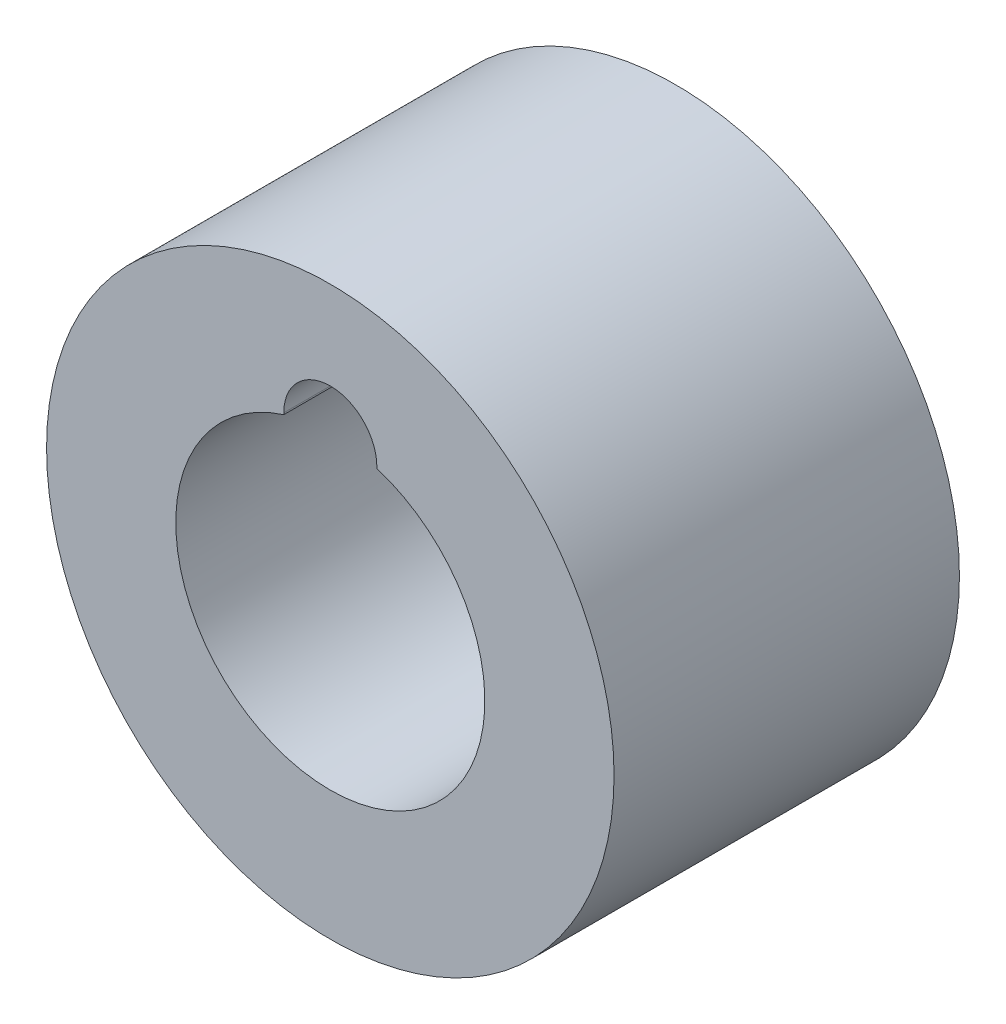
ISO-10303-21;
HEADER;
FILE_DESCRIPTION(('STEP AP214'),'2;1');
FILE_NAME('part.step','',(''),(''),'','','');
FILE_SCHEMA(('AUTOMOTIVE_DESIGN { 1 0 10303 214 1 1 1 1 }'));
ENDSEC;
DATA;
#1=APPLICATION_CONTEXT('core data for automotive mechanical design processes');
#2=APPLICATION_PROTOCOL_DEFINITION('international standard','automotive_design',2000,#1);
#3=PRODUCT_CONTEXT('',#1,'mechanical');
#4=PRODUCT('Part','Part','',(#3));
#5=PRODUCT_RELATED_PRODUCT_CATEGORY('part','',(#4));
#6=PRODUCT_DEFINITION_FORMATION('','',#4);
#7=PRODUCT_DEFINITION_CONTEXT('part definition',#1,'design');
#8=PRODUCT_DEFINITION('design','',#6,#7);
#9=PRODUCT_DEFINITION_SHAPE('','',#8);
#10=(LENGTH_UNIT() NAMED_UNIT(*) SI_UNIT(.MILLI.,.METRE.));
#11=(NAMED_UNIT(*) PLANE_ANGLE_UNIT() SI_UNIT($,.RADIAN.));
#12=(NAMED_UNIT(*) SI_UNIT($,.STERADIAN.) SOLID_ANGLE_UNIT());
#13=UNCERTAINTY_MEASURE_WITH_UNIT(LENGTH_MEASURE(1.E-05),#10,'distance_accuracy_value','');
#14=(GEOMETRIC_REPRESENTATION_CONTEXT(3) GLOBAL_UNCERTAINTY_ASSIGNED_CONTEXT((#13)) GLOBAL_UNIT_ASSIGNED_CONTEXT((#10,
#11,#12)) REPRESENTATION_CONTEXT('',''));
#15=CARTESIAN_POINT('',(0.,0.,0.));
#16=DIRECTION('',(0.,0.,1.));
#17=DIRECTION('',(1.,0.,0.));
#18=AXIS2_PLACEMENT_3D('',#15,#16,#17);
#19=CARTESIAN_POINT('',(0.,0.,9.274999992));
#20=DIRECTION('',(0.,0.,1.));
#21=DIRECTION('',(1.,0.,0.));
#22=AXIS2_PLACEMENT_3D('',#19,#20,#21);
#23=PLANE('',#22);
#24=DIRECTION('',(0.,-1.,0.));
#25=VECTOR('',#24,1.);
#26=CARTESIAN_POINT('',(-1.25,0.,9.274999992));
#27=LINE('',#26,#25);
#28=CARTESIAN_POINT('',(-1.25,4.,9.274999992));
#29=VERTEX_POINT('',#28);
#30=CARTESIAN_POINT('',(-1.25,3.95727178748188,9.274999992));
#31=VERTEX_POINT('',#30);
#32=EDGE_CURVE('E105',#29,#31,#27,.T.);
#33=ORIENTED_EDGE('',*,*,#32,.F.);
#34=CARTESIAN_POINT('',(0.,4.,9.274999992));
#35=DIRECTION('',(0.,0.,1.));
#36=DIRECTION('',(1.,0.,0.));
#37=AXIS2_PLACEMENT_3D('',#34,#35,#36);
#38=CIRCLE('',#37,1.25);
#39=CARTESIAN_POINT('',(1.25,4.,9.274999992));
#40=VERTEX_POINT('',#39);
#41=EDGE_CURVE('E110',#40,#29,#38,.T.);
#42=ORIENTED_EDGE('',*,*,#41,.F.);
#43=DIRECTION('',(0.,1.,0.));
#44=VECTOR('',#43,1.);
#45=CARTESIAN_POINT('',(1.25,0.,9.274999992));
#46=LINE('',#45,#44);
#47=CARTESIAN_POINT('',(1.25,3.95727178748188,9.274999992));
#48=VERTEX_POINT('',#47);
#49=EDGE_CURVE('E86',#48,#40,#46,.T.);
#50=ORIENTED_EDGE('',*,*,#49,.F.);
#51=CARTESIAN_POINT('',(0.,0.,9.274999992));
#52=DIRECTION('',(0.,0.,1.));
#53=DIRECTION('',(1.,0.,0.));
#54=AXIS2_PLACEMENT_3D('',#51,#52,#53);
#55=CIRCLE('',#54,4.15);
#56=EDGE_CURVE('E120',#31,#48,#55,.T.);
#57=ORIENTED_EDGE('',*,*,#56,.F.);
#58=EDGE_LOOP('',(#33,#42,#50,#57));
#59=FACE_BOUND('',#58,.T.);
#60=CARTESIAN_POINT('',(0.,0.,9.274999992));
#61=DIRECTION('',(0.,0.,1.));
#62=DIRECTION('',(1.,0.,0.));
#63=AXIS2_PLACEMENT_3D('',#60,#61,#62);
#64=CIRCLE('',#63,7.62);
#65=CARTESIAN_POINT('',(7.62,0.,9.274999992));
#66=VERTEX_POINT('',#65);
#67=EDGE_CURVE('E127',#66,#66,#64,.T.);
#68=ORIENTED_EDGE('',*,*,#67,.T.);
#69=EDGE_LOOP('',(#68));
#70=FACE_BOUND('',#69,.T.);
#71=ADVANCED_FACE('F43',(#59,#70),#23,.T.);
#72=CARTESIAN_POINT('',(0.,0.,0.));
#73=DIRECTION('',(0.,0.,1.));
#74=DIRECTION('',(1.,0.,0.));
#75=AXIS2_PLACEMENT_3D('',#72,#73,#74);
#76=PLANE('',#75);
#77=CARTESIAN_POINT('',(0.,0.,0.));
#78=DIRECTION('',(0.,0.,1.));
#79=DIRECTION('',(1.,0.,0.));
#80=AXIS2_PLACEMENT_3D('',#77,#78,#79);
#81=CIRCLE('',#80,7.62);
#82=CARTESIAN_POINT('',(7.62,0.,0.));
#83=VERTEX_POINT('',#82);
#84=EDGE_CURVE('E124',#83,#83,#81,.T.);
#85=ORIENTED_EDGE('',*,*,#84,.F.);
#86=EDGE_LOOP('',(#85));
#87=FACE_BOUND('',#86,.T.);
#88=CARTESIAN_POINT('',(0.,4.,0.));
#89=DIRECTION('',(0.,0.,1.));
#90=DIRECTION('',(1.,0.,0.));
#91=AXIS2_PLACEMENT_3D('',#88,#89,#90);
#92=CIRCLE('',#91,1.25);
#93=CARTESIAN_POINT('',(1.25,4.,0.));
#94=VERTEX_POINT('',#93);
#95=CARTESIAN_POINT('',(-1.25,4.,0.));
#96=VERTEX_POINT('',#95);
#97=EDGE_CURVE('E95',#94,#96,#92,.T.);
#98=ORIENTED_EDGE('',*,*,#97,.T.);
#99=DIRECTION('',(0.,-1.,0.));
#100=VECTOR('',#99,1.);
#101=CARTESIAN_POINT('',(-1.25,0.,0.));
#102=LINE('',#101,#100);
#103=CARTESIAN_POINT('',(-1.25,3.95727178748188,0.));
#104=VERTEX_POINT('',#103);
#105=EDGE_CURVE('E92',#96,#104,#102,.T.);
#106=ORIENTED_EDGE('',*,*,#105,.T.);
#107=CARTESIAN_POINT('',(0.,0.,0.));
#108=DIRECTION('',(0.,0.,1.));
#109=DIRECTION('',(1.,0.,0.));
#110=AXIS2_PLACEMENT_3D('',#107,#108,#109);
#111=CIRCLE('',#110,4.15);
#112=CARTESIAN_POINT('',(1.25,3.95727178748188,0.));
#113=VERTEX_POINT('',#112);
#114=EDGE_CURVE('E103',#104,#113,#111,.T.);
#115=ORIENTED_EDGE('',*,*,#114,.T.);
#116=DIRECTION('',(0.,1.,0.));
#117=VECTOR('',#116,1.);
#118=CARTESIAN_POINT('',(1.25,0.,0.));
#119=LINE('',#118,#117);
#120=EDGE_CURVE('E59',#113,#94,#119,.T.);
#121=ORIENTED_EDGE('',*,*,#120,.T.);
#122=EDGE_LOOP('',(#98,#106,#115,#121));
#123=FACE_BOUND('',#122,.T.);
#124=ADVANCED_FACE('F101',(#87,#123),#76,.F.);
#125=CARTESIAN_POINT('',(0.,0.,9.274999992));
#126=DIRECTION('',(0.,0.,-1.));
#127=DIRECTION('',(-1.,0.,0.));
#128=AXIS2_PLACEMENT_3D('',#125,#126,#127);
#129=CYLINDRICAL_SURFACE('',#128,7.62);
#130=ORIENTED_EDGE('',*,*,#67,.F.);
#131=EDGE_LOOP('',(#130));
#132=FACE_BOUND('',#131,.T.);
#133=ORIENTED_EDGE('',*,*,#84,.T.);
#134=EDGE_LOOP('',(#133));
#135=FACE_BOUND('',#134,.T.);
#136=ADVANCED_FACE('F45',(#132,#135),#129,.T.);
#137=CARTESIAN_POINT('',(0.,0.,9.274999992));
#138=DIRECTION('',(0.,0.,-1.));
#139=DIRECTION('',(-1.,0.,0.));
#140=AXIS2_PLACEMENT_3D('',#137,#138,#139);
#141=CYLINDRICAL_SURFACE('',#140,4.15);
#142=DIRECTION('',(0.,0.,-1.));
#143=VECTOR('',#142,1.);
#144=CARTESIAN_POINT('',(-1.25,3.95727178748188,9.274999992));
#145=LINE('',#144,#143);
#146=EDGE_CURVE('E11',#31,#104,#145,.T.);
#147=ORIENTED_EDGE('',*,*,#146,.F.);
#148=ORIENTED_EDGE('',*,*,#56,.T.);
#149=DIRECTION('',(0.,0.,-1.));
#150=VECTOR('',#149,1.);
#151=CARTESIAN_POINT('',(1.25,3.95727178748188,9.274999992));
#152=LINE('',#151,#150);
#153=EDGE_CURVE('E52',#113,#48,#152,.F.);
#154=ORIENTED_EDGE('',*,*,#153,.F.);
#155=ORIENTED_EDGE('',*,*,#114,.F.);
#156=EDGE_LOOP('',(#147,#148,#154,#155));
#157=FACE_BOUND('',#156,.T.);
#158=ADVANCED_FACE('F140',(#157),#141,.F.);
#159=CARTESIAN_POINT('',(-1.25,0.,0.));
#160=DIRECTION('',(-1.,0.,0.));
#161=DIRECTION('',(0.,0.,1.));
#162=AXIS2_PLACEMENT_3D('',#159,#160,#161);
#163=PLANE('',#162);
#164=ORIENTED_EDGE('',*,*,#146,.T.);
#165=ORIENTED_EDGE('',*,*,#105,.F.);
#166=DIRECTION('',(0.,0.,1.));
#167=VECTOR('',#166,1.);
#168=CARTESIAN_POINT('',(-1.25,4.,0.));
#169=LINE('',#168,#167);
#170=EDGE_CURVE('E91',#96,#29,#169,.T.);
#171=ORIENTED_EDGE('',*,*,#170,.T.);
#172=ORIENTED_EDGE('',*,*,#32,.T.);
#173=EDGE_LOOP('',(#164,#165,#171,#172));
#174=FACE_BOUND('',#173,.T.);
#175=ADVANCED_FACE('F142',(#174),#163,.F.);
#176=CARTESIAN_POINT('',(0.,4.,0.));
#177=DIRECTION('',(0.,0.,1.));
#178=DIRECTION('',(1.,0.,0.));
#179=AXIS2_PLACEMENT_3D('',#176,#177,#178);
#180=CYLINDRICAL_SURFACE('',#179,1.25);
#181=ORIENTED_EDGE('',*,*,#41,.T.);
#182=ORIENTED_EDGE('',*,*,#170,.F.);
#183=ORIENTED_EDGE('',*,*,#97,.F.);
#184=DIRECTION('',(0.,0.,1.));
#185=VECTOR('',#184,1.);
#186=CARTESIAN_POINT('',(1.25,4.,0.));
#187=LINE('',#186,#185);
#188=EDGE_CURVE('E82',#94,#40,#187,.T.);
#189=ORIENTED_EDGE('',*,*,#188,.T.);
#190=EDGE_LOOP('',(#181,#182,#183,#189));
#191=FACE_BOUND('',#190,.T.);
#192=ADVANCED_FACE('F96',(#191),#180,.F.);
#193=CARTESIAN_POINT('',(1.25,0.,0.));
#194=DIRECTION('',(1.,0.,0.));
#195=DIRECTION('',(0.,0.,-1.));
#196=AXIS2_PLACEMENT_3D('',#193,#194,#195);
#197=PLANE('',#196);
#198=ORIENTED_EDGE('',*,*,#153,.T.);
#199=ORIENTED_EDGE('',*,*,#49,.T.);
#200=ORIENTED_EDGE('',*,*,#188,.F.);
#201=ORIENTED_EDGE('',*,*,#120,.F.);
#202=EDGE_LOOP('',(#198,#199,#200,#201));
#203=FACE_BOUND('',#202,.T.);
#204=ADVANCED_FACE('F84',(#203),#197,.F.);
#205=CLOSED_SHELL('',(#71,#124,#136,#158,#175,#192,#204));
#206=MANIFOLD_SOLID_BREP('B2',#205);
#207=ADVANCED_BREP_SHAPE_REPRESENTATION('',(#18,#206),#14);
#208=SHAPE_DEFINITION_REPRESENTATION(#9,#207);
ENDSEC;
END-ISO-10303-21;
